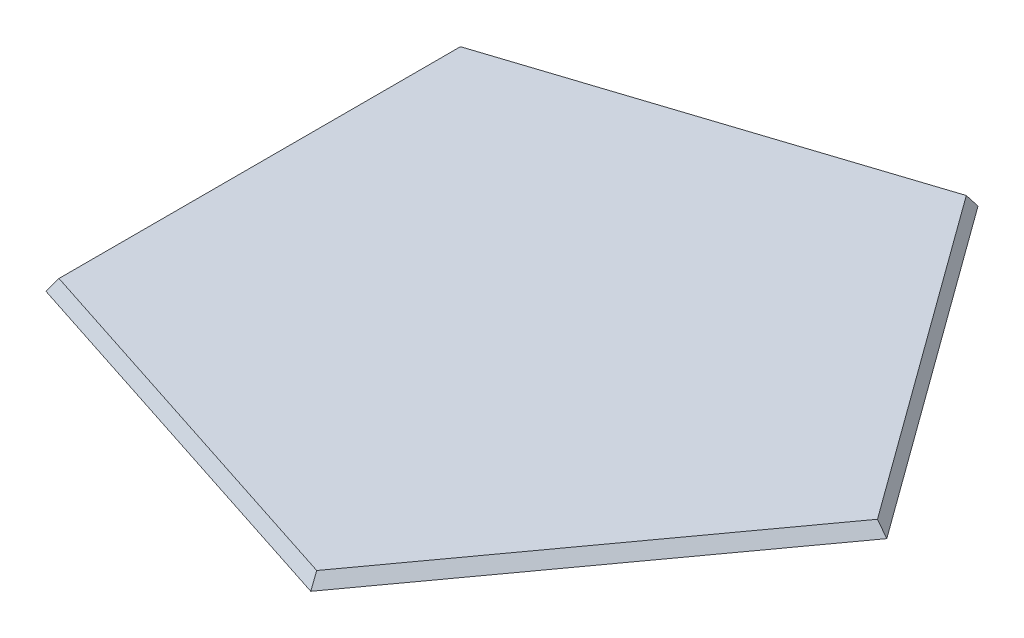
ISO-10303-21;
HEADER;
FILE_DESCRIPTION(('STEP AP214'),'2;1');
FILE_NAME('part.step','',(''),(''),'','','');
FILE_SCHEMA(('AUTOMOTIVE_DESIGN { 1 0 10303 214 1 1 1 1 }'));
ENDSEC;
DATA;
#1=APPLICATION_CONTEXT('core data for automotive mechanical design processes');
#2=APPLICATION_PROTOCOL_DEFINITION('international standard','automotive_design',2000,#1);
#3=PRODUCT_CONTEXT('',#1,'mechanical');
#4=PRODUCT('Part','Part','',(#3));
#5=PRODUCT_RELATED_PRODUCT_CATEGORY('part','',(#4));
#6=PRODUCT_DEFINITION_FORMATION('','',#4);
#7=PRODUCT_DEFINITION_CONTEXT('part definition',#1,'design');
#8=PRODUCT_DEFINITION('design','',#6,#7);
#9=PRODUCT_DEFINITION_SHAPE('','',#8);
#10=(LENGTH_UNIT() NAMED_UNIT(*) SI_UNIT(.MILLI.,.METRE.));
#11=(NAMED_UNIT(*) PLANE_ANGLE_UNIT() SI_UNIT($,.RADIAN.));
#12=(NAMED_UNIT(*) SI_UNIT($,.STERADIAN.) SOLID_ANGLE_UNIT());
#13=UNCERTAINTY_MEASURE_WITH_UNIT(LENGTH_MEASURE(1.E-05),#10,'distance_accuracy_value','');
#14=(GEOMETRIC_REPRESENTATION_CONTEXT(3) GLOBAL_UNCERTAINTY_ASSIGNED_CONTEXT((#13)) GLOBAL_UNIT_ASSIGNED_CONTEXT((#10,
#11,#12)) REPRESENTATION_CONTEXT('',''));
#15=CARTESIAN_POINT('',(0.,0.,0.));
#16=DIRECTION('',(0.,0.,1.));
#17=DIRECTION('',(1.,0.,0.));
#18=AXIS2_PLACEMENT_3D('',#15,#16,#17);
#19=CARTESIAN_POINT('',(0.,3.,0.));
#20=DIRECTION('',(0.,1.,0.));
#21=DIRECTION('',(0.,0.,1.));
#22=AXIS2_PLACEMENT_3D('',#19,#20,#21);
#23=PLANE('',#22);
#24=DIRECTION('',(-0.951056516295154,0.,0.309016994374947));
#25=VECTOR('',#24,1.);
#26=CARTESIAN_POINT('',(-69.4271063103227,3.,-49.0947914831041));
#27=LINE('',#26,#25);
#28=CARTESIAN_POINT('',(26.0294852431856,3.,-80.1105182140986));
#29=VERTEX_POINT('',#28);
#30=CARTESIAN_POINT('',(-68.1460770763237,3.,-49.5110231126805));
#31=VERTEX_POINT('',#30);
#32=EDGE_CURVE('E42',#29,#31,#27,.T.);
#33=ORIENTED_EDGE('',*,*,#32,.T.);
#34=DIRECTION('',(0.,0.,1.));
#35=VECTOR('',#34,1.);
#36=CARTESIAN_POINT('',(-68.1460770763238,3.,50.8579769603753));
#37=LINE('',#36,#35);
#38=CARTESIAN_POINT('',(-68.1460770763238,3.,49.5110231126804));
#39=VERTEX_POINT('',#38);
#40=EDGE_CURVE('E11',#31,#39,#37,.T.);
#41=ORIENTED_EDGE('',*,*,#40,.T.);
#42=DIRECTION('',(0.951056516295154,0.,0.309016994374948));
#43=VECTOR('',#42,1.);
#44=CARTESIAN_POINT('',(27.3105144771846,3.,80.526749843675));
#45=LINE('',#44,#43);
#46=CARTESIAN_POINT('',(26.0294852431856,3.,80.1105182140986));
#47=VERTEX_POINT('',#46);
#48=EDGE_CURVE('E113',#39,#47,#45,.T.);
#49=ORIENTED_EDGE('',*,*,#48,.T.);
#50=DIRECTION('',(0.587785252292473,0.,-0.809016994374947));
#51=VECTOR('',#50,1.);
#52=CARTESIAN_POINT('',(85.0249032734699,3.,-1.08970855342382));
#53=LINE('',#52,#51);
#54=CARTESIAN_POINT('',(84.2331836662763,3.,0.));
#55=VERTEX_POINT('',#54);
#56=EDGE_CURVE('E96',#47,#55,#53,.T.);
#57=ORIENTED_EDGE('',*,*,#56,.T.);
#58=DIRECTION('',(-0.587785252292473,0.,-0.809016994374948));
#59=VECTOR('',#58,1.);
#60=CARTESIAN_POINT('',(25.237765635992,3.,-81.2002267675224));
#61=LINE('',#60,#59);
#62=EDGE_CURVE('E53',#55,#29,#61,.T.);
#63=ORIENTED_EDGE('',*,*,#62,.T.);
#64=EDGE_LOOP('',(#33,#41,#49,#57,#63));
#65=FACE_BOUND('',#64,.T.);
#66=ADVANCED_FACE('F33',(#65),#23,.T.);
#67=CARTESIAN_POINT('',(0.,0.,0.));
#68=DIRECTION('',(0.,1.,0.));
#69=DIRECTION('',(0.,0.,1.));
#70=AXIS2_PLACEMENT_3D('',#67,#68,#69);
#71=PLANE('',#70);
#72=DIRECTION('',(0.951056516295154,0.,0.309016994374948));
#73=VECTOR('',#72,1.);
#74=CARTESIAN_POINT('',(-70.,0.,50.8579769603753));
#75=LINE('',#74,#73);
#76=CARTESIAN_POINT('',(-70.,0.,50.8579769603753));
#77=VERTEX_POINT('',#76);
#78=CARTESIAN_POINT('',(26.7376207875073,0.,82.2899353209463));
#79=VERTEX_POINT('',#78);
#80=EDGE_CURVE('E84',#77,#79,#75,.T.);
#81=ORIENTED_EDGE('',*,*,#80,.F.);
#82=DIRECTION('',(0.,0.,1.));
#83=VECTOR('',#82,1.);
#84=CARTESIAN_POINT('',(-70.,0.,-50.8579769603753));
#85=LINE('',#84,#83);
#86=CARTESIAN_POINT('',(-70.,0.,-50.8579769603753));
#87=VERTEX_POINT('',#86);
#88=EDGE_CURVE('E111',#87,#77,#85,.T.);
#89=ORIENTED_EDGE('',*,*,#88,.F.);
#90=DIRECTION('',(-0.951056516295154,0.,0.309016994374947));
#91=VECTOR('',#90,1.);
#92=CARTESIAN_POINT('',(26.7376207875074,0.,-82.2899353209463));
#93=LINE('',#92,#91);
#94=CARTESIAN_POINT('',(26.7376207875074,0.,-82.2899353209463));
#95=VERTEX_POINT('',#94);
#96=EDGE_CURVE('E108',#95,#87,#93,.T.);
#97=ORIENTED_EDGE('',*,*,#96,.F.);
#98=DIRECTION('',(-0.587785252292473,0.,-0.809016994374947));
#99=VECTOR('',#98,1.);
#100=CARTESIAN_POINT('',(86.5247584249853,0.,0.));
#101=LINE('',#100,#99);
#102=CARTESIAN_POINT('',(86.5247584249853,0.,0.));
#103=VERTEX_POINT('',#102);
#104=EDGE_CURVE('E87',#103,#95,#101,.T.);
#105=ORIENTED_EDGE('',*,*,#104,.F.);
#106=DIRECTION('',(0.587785252292473,0.,-0.809016994374947));
#107=VECTOR('',#106,1.);
#108=CARTESIAN_POINT('',(26.7376207875073,0.,82.2899353209463));
#109=LINE('',#108,#107);
#110=EDGE_CURVE('E79',#79,#103,#109,.T.);
#111=ORIENTED_EDGE('',*,*,#110,.F.);
#112=EDGE_LOOP('',(#81,#89,#97,#105,#111));
#113=FACE_BOUND('',#112,.T.);
#114=ADVANCED_FACE('F81',(#113),#71,.F.);
#115=CARTESIAN_POINT('',(55.1313344547309,3.,-40.0552591070492));
#116=DIRECTION('',(0.688209327963415,0.525694374889677,-0.50001334493541));
#117=DIRECTION('',(0.587785252292473,0.,0.809016994374948));
#118=AXIS2_PLACEMENT_3D('',#115,#116,#117);
#119=PLANE('',#118);
#120=DIRECTION('',(-0.187581034297649,0.794682751636107,0.577315061144164));
#121=VECTOR('',#120,1.);
#122=CARTESIAN_POINT('',(22.7157632180256,17.0385073947974,-69.911930490489));
#123=LINE('',#122,#121);
#124=EDGE_CURVE('E99',#29,#95,#123,.F.);
#125=ORIENTED_EDGE('',*,*,#124,.F.);
#126=ORIENTED_EDGE('',*,*,#62,.F.);
#127=DIRECTION('',(-0.607024978276896,0.794682751636107,0.));
#128=VECTOR('',#127,1.);
#129=CARTESIAN_POINT('',(73.5097539343204,17.0385073947977,1.11022302462516E-13));
#130=LINE('',#129,#128);
#131=EDGE_CURVE('E37',#103,#55,#130,.T.);
#132=ORIENTED_EDGE('',*,*,#131,.F.);
#133=ORIENTED_EDGE('',*,*,#104,.T.);
#134=EDGE_LOOP('',(#125,#126,#132,#133));
#135=FACE_BOUND('',#134,.T.);
#136=ADVANCED_FACE('F35',(#135),#119,.T.);
#137=CARTESIAN_POINT('',(55.1313344547309,3.,40.0552591070493));
#138=DIRECTION('',(0.688209327963417,0.525694374889672,0.500013344935411));
#139=DIRECTION('',(-0.587785252292473,0.,0.809016994374947));
#140=AXIS2_PLACEMENT_3D('',#137,#138,#139);
#141=PLANE('',#140);
#142=ORIENTED_EDGE('',*,*,#131,.T.);
#143=ORIENTED_EDGE('',*,*,#56,.F.);
#144=DIRECTION('',(-0.187581034297645,0.794682751636109,-0.577315061144163));
#145=VECTOR('',#144,1.);
#146=CARTESIAN_POINT('',(22.7157632180257,17.0385073947976,69.911930490489));
#147=LINE('',#146,#145);
#148=EDGE_CURVE('E94',#79,#47,#147,.T.);
#149=ORIENTED_EDGE('',*,*,#148,.F.);
#150=ORIENTED_EDGE('',*,*,#110,.T.);
#151=EDGE_LOOP('',(#142,#143,#149,#150));
#152=FACE_BOUND('',#151,.T.);
#153=ADVANCED_FACE('F95',(#152),#141,.T.);
#154=CARTESIAN_POINT('',(-21.0582959165691,3.,-64.8107706633895));
#155=DIRECTION('',(-0.262872571907302,0.525694374889672,-0.809038586934021));
#156=DIRECTION('',(0.951056516295154,0.,-0.309016994374947));
#157=AXIS2_PLACEMENT_3D('',#154,#155,#156);
#158=PLANE('',#157);
#159=ORIENTED_EDGE('',*,*,#124,.T.);
#160=ORIENTED_EDGE('',*,*,#96,.T.);
#161=DIRECTION('',(0.491093523436092,0.794682751636108,0.356800330004316));
#162=VECTOR('',#161,1.);
#163=CARTESIAN_POINT('',(-59.470640185186,17.0385073947976,-43.2079492622423));
#164=LINE('',#163,#162);
#165=EDGE_CURVE('E100',#31,#87,#164,.F.);
#166=ORIENTED_EDGE('',*,*,#165,.F.);
#167=ORIENTED_EDGE('',*,*,#32,.F.);
#168=EDGE_LOOP('',(#159,#160,#166,#167));
#169=FACE_BOUND('',#168,.T.);
#170=ADVANCED_FACE('F121',(#169),#158,.T.);
#171=CARTESIAN_POINT('',(-21.0582959165691,3.,64.8107706633895));
#172=DIRECTION('',(-0.262872571907302,0.525694374889671,0.809038586934022));
#173=DIRECTION('',(-0.951056516295154,0.,-0.309016994374948));
#174=AXIS2_PLACEMENT_3D('',#171,#172,#173);
#175=PLANE('',#174);
#176=ORIENTED_EDGE('',*,*,#148,.T.);
#177=ORIENTED_EDGE('',*,*,#48,.F.);
#178=DIRECTION('',(-0.491093523436092,-0.794682751636108,0.356800330004314));
#179=VECTOR('',#178,1.);
#180=CARTESIAN_POINT('',(-59.4706401851859,17.0385073947976,43.2079492622423));
#181=LINE('',#180,#179);
#182=EDGE_CURVE('E104',#77,#39,#181,.F.);
#183=ORIENTED_EDGE('',*,*,#182,.F.);
#184=ORIENTED_EDGE('',*,*,#80,.T.);
#185=EDGE_LOOP('',(#176,#177,#183,#184));
#186=FACE_BOUND('',#185,.T.);
#187=ADVANCED_FACE('F103',(#186),#175,.T.);
#188=CARTESIAN_POINT('',(-68.1460770763237,3.,0.));
#189=DIRECTION('',(-0.850673512112229,0.525694374889674,0.));
#190=DIRECTION('',(0.,0.,-1.));
#191=AXIS2_PLACEMENT_3D('',#188,#189,#190);
#192=PLANE('',#191);
#193=ORIENTED_EDGE('',*,*,#165,.T.);
#194=ORIENTED_EDGE('',*,*,#88,.T.);
#195=ORIENTED_EDGE('',*,*,#182,.T.);
#196=ORIENTED_EDGE('',*,*,#40,.F.);
#197=EDGE_LOOP('',(#193,#194,#195,#196));
#198=FACE_BOUND('',#197,.T.);
#199=ADVANCED_FACE('F134',(#198),#192,.T.);
#200=CLOSED_SHELL('',(#66,#114,#136,#153,#170,#187,#199));
#201=MANIFOLD_SOLID_BREP('B2',#200);
#202=ADVANCED_BREP_SHAPE_REPRESENTATION('',(#18,#201),#14);
#203=SHAPE_DEFINITION_REPRESENTATION(#9,#202);
ENDSEC;
END-ISO-10303-21;
